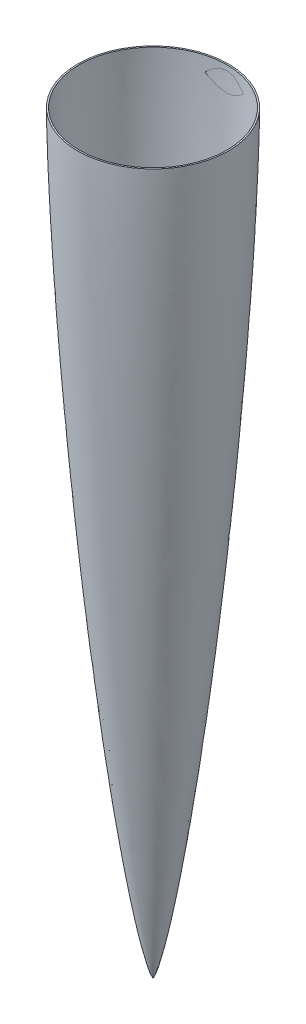
ISO-10303-21;
HEADER;
FILE_DESCRIPTION(('STEP AP214'),'2;1');
FILE_NAME('part.step','',(''),(''),'','','');
FILE_SCHEMA(('AUTOMOTIVE_DESIGN { 1 0 10303 214 1 1 1 1 }'));
ENDSEC;
DATA;
#1=APPLICATION_CONTEXT('core data for automotive mechanical design processes');
#2=APPLICATION_PROTOCOL_DEFINITION('international standard','automotive_design',2000,#1);
#3=PRODUCT_CONTEXT('',#1,'mechanical');
#4=PRODUCT('Part','Part','',(#3));
#5=PRODUCT_RELATED_PRODUCT_CATEGORY('part','',(#4));
#6=PRODUCT_DEFINITION_FORMATION('','',#4);
#7=PRODUCT_DEFINITION_CONTEXT('part definition',#1,'design');
#8=PRODUCT_DEFINITION('design','',#6,#7);
#9=PRODUCT_DEFINITION_SHAPE('','',#8);
#10=(LENGTH_UNIT() NAMED_UNIT(*) SI_UNIT(.MILLI.,.METRE.));
#11=(NAMED_UNIT(*) PLANE_ANGLE_UNIT() SI_UNIT($,.RADIAN.));
#12=(NAMED_UNIT(*) SI_UNIT($,.STERADIAN.) SOLID_ANGLE_UNIT());
#13=UNCERTAINTY_MEASURE_WITH_UNIT(LENGTH_MEASURE(1.E-05),#10,'distance_accuracy_value','');
#14=(GEOMETRIC_REPRESENTATION_CONTEXT(3) GLOBAL_UNCERTAINTY_ASSIGNED_CONTEXT((#13)) GLOBAL_UNIT_ASSIGNED_CONTEXT((#10,
#11,#12)) REPRESENTATION_CONTEXT('',''));
#15=CARTESIAN_POINT('',(0.,0.,0.));
#16=DIRECTION('',(0.,0.,1.));
#17=DIRECTION('',(1.,0.,0.));
#18=AXIS2_PLACEMENT_3D('',#15,#16,#17);
#19=CARTESIAN_POINT('',(0.,1524.,0.));
#20=DIRECTION('',(0.,-1.,0.));
#21=DIRECTION('',(0.,0.,-1.));
#22=AXIS2_PLACEMENT_3D('',#19,#20,#21);
#23=PLANE('',#22);
#24=CARTESIAN_POINT('',(0.,1524.,0.));
#25=DIRECTION('',(0.,-1.,0.));
#26=DIRECTION('',(0.,0.,-1.));
#27=AXIS2_PLACEMENT_3D('',#24,#25,#26);
#28=CIRCLE('',#27,149.399995259078);
#29=CARTESIAN_POINT('',(0.,1524.,-149.399995259078));
#30=VERTEX_POINT('',#29);
#31=EDGE_CURVE('E49',#30,#30,#28,.T.);
#32=ORIENTED_EDGE('',*,*,#31,.T.);
#33=EDGE_LOOP('',(#32));
#34=FACE_BOUND('',#33,.T.);
#35=CARTESIAN_POINT('',(0.,1524.,0.));
#36=DIRECTION('',(0.,-1.,0.));
#37=DIRECTION('',(0.,0.,-1.));
#38=AXIS2_PLACEMENT_3D('',#35,#36,#37);
#39=CIRCLE('',#38,152.4);
#40=CARTESIAN_POINT('',(0.,1524.,-152.4));
#41=VERTEX_POINT('',#40);
#42=EDGE_CURVE('E11',#41,#41,#39,.T.);
#43=ORIENTED_EDGE('',*,*,#42,.F.);
#44=EDGE_LOOP('',(#43));
#45=FACE_BOUND('',#44,.T.);
#46=ADVANCED_FACE('F43',(#34,#45),#23,.F.);
#47=CARTESIAN_POINT('',(0.,1524.,152.4));
#48=CARTESIAN_POINT('',(0.,1521.53568050317,152.395628722459));
#49=CARTESIAN_POINT('',(0.,1516.60712853408,152.362707824974));
#50=CARTESIAN_POINT('',(0.,1506.75036650977,152.25898736052));
#51=CARTESIAN_POINT('',(0.,1491.96624087527,152.024358370584));
#52=CARTESIAN_POINT('',(0.,1474.71955835831,151.671460190238));
#53=CARTESIAN_POINT('',(0.,1448.16473396309,151.010913327167));
#54=CARTESIAN_POINT('',(0.,1414.76845078516,150.000622863617));
#55=CARTESIAN_POINT('',(0.,1374.53442132453,148.553508869586));
#56=CARTESIAN_POINT('',(0.,1327.46719210482,146.584126696371));
#57=CARTESIAN_POINT('',(0.,1268.64659039088,143.821063480984));
#58=CARTESIAN_POINT('',(0.,1198.08333332252,140.071466306924));
#59=CARTESIAN_POINT('',(0.,1115.7910291249,135.136696370839));
#60=CARTESIAN_POINT('',(0.,1021.78710913982,128.801272239232));
#61=CARTESIAN_POINT('',(0.,927.82974614443,121.810111121396));
#62=CARTESIAN_POINT('',(0.,833.922122588586,114.18005845833));
#63=CARTESIAN_POINT('',(0.,740.06872804402,105.909330238404));
#64=CARTESIAN_POINT('',(0.,646.275860995221,96.977630900728));
#65=CARTESIAN_POINT('',(0.,552.552386087896,87.3435956773155));
#66=CARTESIAN_POINT('',(0.,458.911254582011,76.9375731883505));
#67=CARTESIAN_POINT('',(0.,377.064507832731,67.0587719531241));
#68=CARTESIAN_POINT('',(0.,306.994191139809,57.9227193178524));
#69=CARTESIAN_POINT('',(0.,248.676771970827,49.7601957810551));
#70=CARTESIAN_POINT('',(0.,202.079624895494,42.8365860425711));
#71=CARTESIAN_POINT('',(0.,153.127410240741,35.045617713457));
#72=CARTESIAN_POINT('',(0.,111.509421775576,27.7892992188199));
#73=CARTESIAN_POINT('',(0.,77.213765080959,21.191204307775));
#74=CARTESIAN_POINT('',(0.,49.9837066694846,15.3040734435675));
#75=CARTESIAN_POINT('',(0.,34.2023586445506,11.5665873148164));
#76=CARTESIAN_POINT('',(0.,21.4878668486139,8.20445693610988));
#77=CARTESIAN_POINT('',(0.,12.4183987756164,5.43489889232557));
#78=CARTESIAN_POINT('',(0.,7.70022289015027,3.78712850953246));
#79=CARTESIAN_POINT('',(0.,5.24838346585034,2.83197588814664));
#80=CARTESIAN_POINT('',(0.,3.95823736587218,2.28701277693296));
#81=CARTESIAN_POINT('',(0.,3.32523532989472,2.00639453517898));
#82=CARTESIAN_POINT('',(0.,2.73002405771777,1.73075733195023));
#83=CARTESIAN_POINT('',(0.,2.24282540604074,1.49434862489618));
#84=CARTESIAN_POINT('',(0.,1.79878368162333,1.26801725105797));
#85=CARTESIAN_POINT('',(0.,1.3805140783841,1.03915253918923));
#86=CARTESIAN_POINT('',(0.,1.08630400061248,0.868078740313597));
#87=CARTESIAN_POINT('',(0.,0.840927563647121,0.716336462312518));
#88=CARTESIAN_POINT('',(0.,0.641104574805712,0.585434487024369));
#89=CARTESIAN_POINT('',(0.,0.466313208156416,0.461855796292368));
#90=CARTESIAN_POINT('',(0.,0.316636954176449,0.345966558933326));
#91=CARTESIAN_POINT('',(0.,0.197260922346309,0.242935889185389));
#92=CARTESIAN_POINT('',(0.,0.117712206300386,0.166235145023009));
#93=CARTESIAN_POINT('',(0.,0.0602326607252109,0.10126755691197));
#94=CARTESIAN_POINT('',(0.,0.0228401150590778,0.0501833866003668));
#95=CARTESIAN_POINT('',(0.,0.00798466837960977,0.0223856697222691));
#96=CARTESIAN_POINT('',(0.,0.00238035997467786,0.00760113607788082));
#97=CARTESIAN_POINT('',(0.,0.,0.));
#98=B_SPLINE_CURVE_WITH_KNOTS('',4,(#47,#48,#49,#50,#51,#52,#53,#54,#55,#56,#57,#58,#59,#60,#61,
#62,#63,#64,#65,#66,#67,#68,#69,#70,#71,#72,#73,#74,#75,#76,#77,#78,#79,#80,#81,#82,#83,#84,#85,
#86,#87,#88,#89,#90,#91,#92,#93,#94,#95,#96,#97),.UNSPECIFIED.,.F.,.F.,(5,1,1,1,1,1,1,1,1,1,1,1,
1,1,1,1,1,1,1,1,1,1,1,1,1,1,1,1,1,1,1,1,1,1,1,1,1,1,1,1,1,1,1,1,1,1,1,5),(0.,
0.00642461790585935,0.0128492358117187,0.0256984716234375,0.0385477074351563,0.051396943246875,
0.082100360852272,0.112803778457669,0.143507196302502,0.174210614147336,0.23561744858637,
0.297024283717592,0.358431119418529,0.419837954270915,0.481244788848652,0.542651623684501,
0.604058458651421,0.665465293578795,0.726872128205118,0.788278962131132,0.818982378631806,
0.849685795132479,0.88038921443128,0.911092633730081,0.948206196227928,0.959818596313313,
0.971430996398699,0.98371923647716,0.990484137478658,0.99409832301046,0.99614747953197,
0.996745211167998,0.997342942804025,0.99774934703577,0.997952549151642,0.998455208251285,
0.998754665235056,0.999048506387141,0.999195426963183,0.999342347539226,0.999506760654419,
0.999671173769613,0.99975338032721,0.999835586884806,0.999917793442403,0.999958896721202,
0.999979448360601,1.),.UNSPECIFIED.);
#99=CARTESIAN_POINT('',(0.,0.,0.));
#100=DIRECTION('',(0.,-1.,0.));
#101=AXIS1_PLACEMENT('',#99,#100);
#102=SURFACE_OF_REVOLUTION('',#98,#101);
#103=CARTESIAN_POINT('',(0.,0.,0.));
#104=VERTEX_POINT('',#103);
#105=VERTEX_LOOP('',#104);
#106=FACE_BOUND('',#105,.T.);
#107=ORIENTED_EDGE('',*,*,#42,.T.);
#108=EDGE_LOOP('',(#107));
#109=FACE_BOUND('',#108,.T.);
#110=ADVANCED_FACE('F56',(#106,#109),#102,.T.);
#111=CARTESIAN_POINT('',(0.,1524.,152.4));
#112=CARTESIAN_POINT('',(0.,1521.53568050317,152.395628722459));
#113=CARTESIAN_POINT('',(0.,1516.60712853408,152.362707824974));
#114=CARTESIAN_POINT('',(0.,1506.75036650977,152.25898736052));
#115=CARTESIAN_POINT('',(0.,1491.96624087527,152.024358370584));
#116=CARTESIAN_POINT('',(0.,1474.71955835831,151.671460190238));
#117=CARTESIAN_POINT('',(0.,1448.16473396309,151.010913327167));
#118=CARTESIAN_POINT('',(0.,1414.76845078516,150.000622863617));
#119=CARTESIAN_POINT('',(0.,1374.53442132453,148.553508869586));
#120=CARTESIAN_POINT('',(0.,1327.46719210482,146.584126696371));
#121=CARTESIAN_POINT('',(0.,1268.64659039088,143.821063480984));
#122=CARTESIAN_POINT('',(0.,1198.08333332252,140.071466306924));
#123=CARTESIAN_POINT('',(0.,1115.7910291249,135.136696370839));
#124=CARTESIAN_POINT('',(0.,1021.78710913982,128.801272239232));
#125=CARTESIAN_POINT('',(0.,927.82974614443,121.810111121396));
#126=CARTESIAN_POINT('',(0.,833.922122588586,114.18005845833));
#127=CARTESIAN_POINT('',(0.,740.06872804402,105.909330238404));
#128=CARTESIAN_POINT('',(0.,646.275860995221,96.977630900728));
#129=CARTESIAN_POINT('',(0.,552.552386087896,87.3435956773155));
#130=CARTESIAN_POINT('',(0.,458.911254582011,76.9375731883505));
#131=CARTESIAN_POINT('',(0.,377.064507832731,67.0587719531241));
#132=CARTESIAN_POINT('',(0.,306.994191139809,57.9227193178524));
#133=CARTESIAN_POINT('',(0.,248.676771970827,49.7601957810551));
#134=CARTESIAN_POINT('',(0.,202.079624895494,42.8365860425711));
#135=CARTESIAN_POINT('',(0.,153.127410240741,35.045617713457));
#136=CARTESIAN_POINT('',(0.,111.509421775576,27.7892992188199));
#137=CARTESIAN_POINT('',(0.,77.213765080959,21.191204307775));
#138=CARTESIAN_POINT('',(0.,49.9837066694846,15.3040734435675));
#139=CARTESIAN_POINT('',(0.,34.2023586445506,11.5665873148164));
#140=CARTESIAN_POINT('',(0.,21.4878668486139,8.20445693610988));
#141=CARTESIAN_POINT('',(0.,12.4183987756164,5.43489889232557));
#142=CARTESIAN_POINT('',(0.,7.91330757286086,3.86154596189556));
#143=CARTESIAN_POINT('',(0.,5.88291136234203,3.07835881757692));
#144=CARTESIAN_POINT('',(0.,5.15098501737785,2.78206575542948));
#145=CARTESIAN_POINT('',(0.,5.14762668367044,2.78070596296121));
#146=B_SPLINE_CURVE_WITH_KNOTS('',4,(#111,#112,#113,#114,#115,#116,#117,#118,#119,#120,#121,
#122,#123,#124,#125,#126,#127,#128,#129,#130,#131,#132,#133,#134,#135,#136,#137,#138,#139,#140,
#141,#142,#143,#144,#145),.UNSPECIFIED.,.F.,.F.,(5,1,1,1,1,1,1,1,1,1,1,1,1,1,1,1,1,1,1,1,1,1,1,
1,1,1,1,1,1,1,1,5),(0.,0.00642461790585935,0.0128492358117187,0.0256984716234375,
0.0385477074351563,0.051396943246875,0.082100360852272,0.112803778457669,0.143507196302502,
0.174210614147336,0.23561744858637,0.297024283717592,0.358431119418529,0.419837954270915,
0.481244788848652,0.542651623684501,0.604058458651421,0.665465293578795,0.726872128205118,
0.788278962131132,0.818982378631806,0.849685795132479,0.88038921443128,0.911092633730081,
0.948206196227928,0.959818596313313,0.971430996398699,0.98371923647716,0.990484137478658,
0.99409832301046,0.99614747953197,0.996156925408549),.UNSPECIFIED.);
#147=CARTESIAN_POINT('',(0.,0.,0.));
#148=DIRECTION('',(0.,-1.,0.));
#149=AXIS1_PLACEMENT('',#147,#148);
#150=SURFACE_OF_REVOLUTION('',#146,#149);
#151=OFFSET_SURFACE('',#150,-3.,.F.);
#152=CARTESIAN_POINT('',(0.,6.27353713639395,0.));
#153=VERTEX_POINT('',#152);
#154=VERTEX_LOOP('',#153);
#155=FACE_BOUND('',#154,.T.);
#156=ORIENTED_EDGE('',*,*,#31,.F.);
#157=EDGE_LOOP('',(#156));
#158=FACE_BOUND('',#157,.T.);
#159=ADVANCED_FACE('F57',(#155,#158),#151,.F.);
#160=CLOSED_SHELL('',(#46,#110,#159));
#161=MANIFOLD_SOLID_BREP('B2',#160);
#162=ADVANCED_BREP_SHAPE_REPRESENTATION('',(#18,#161),#14);
#163=SHAPE_DEFINITION_REPRESENTATION(#9,#162);
ENDSEC;
END-ISO-10303-21;
